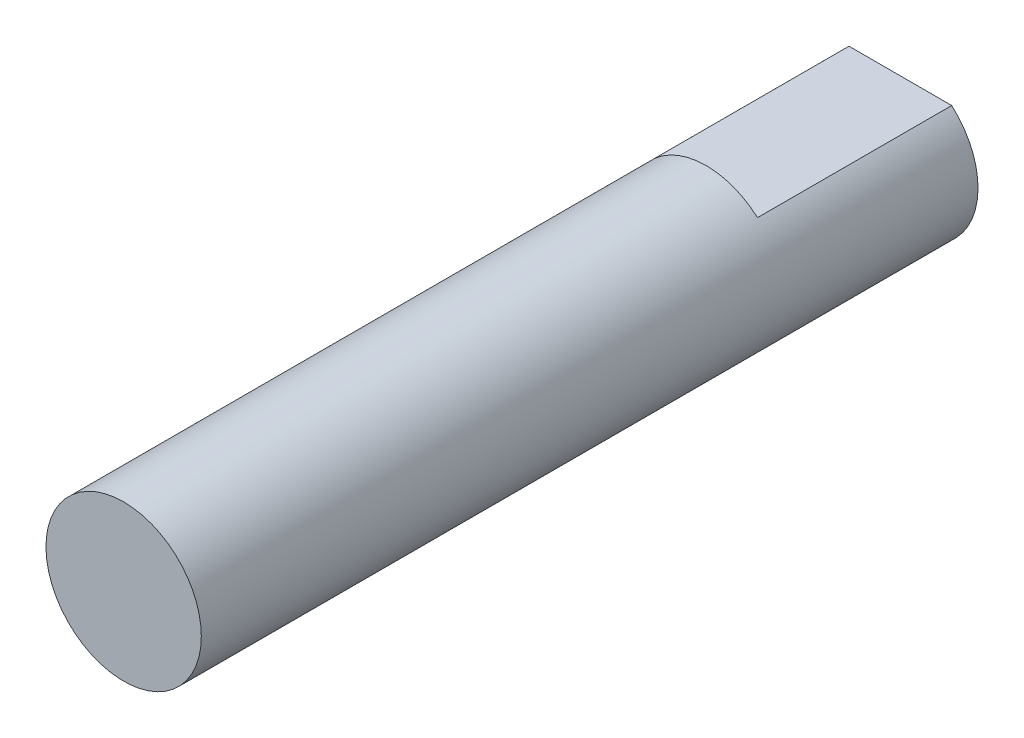
ISO-10303-21;
HEADER;
FILE_DESCRIPTION(('STEP AP214'),'2;1');
FILE_NAME('part.step','',(''),(''),'','','');
FILE_SCHEMA(('AUTOMOTIVE_DESIGN { 1 0 10303 214 1 1 1 1 }'));
ENDSEC;
DATA;
#1=APPLICATION_CONTEXT('core data for automotive mechanical design processes');
#2=APPLICATION_PROTOCOL_DEFINITION('international standard','automotive_design',2000,#1);
#3=PRODUCT_CONTEXT('',#1,'mechanical');
#4=PRODUCT('Part','Part','',(#3));
#5=PRODUCT_RELATED_PRODUCT_CATEGORY('part','',(#4));
#6=PRODUCT_DEFINITION_FORMATION('','',#4);
#7=PRODUCT_DEFINITION_CONTEXT('part definition',#1,'design');
#8=PRODUCT_DEFINITION('design','',#6,#7);
#9=PRODUCT_DEFINITION_SHAPE('','',#8);
#10=(LENGTH_UNIT() NAMED_UNIT(*) SI_UNIT(.MILLI.,.METRE.));
#11=(NAMED_UNIT(*) PLANE_ANGLE_UNIT() SI_UNIT($,.RADIAN.));
#12=(NAMED_UNIT(*) SI_UNIT($,.STERADIAN.) SOLID_ANGLE_UNIT());
#13=UNCERTAINTY_MEASURE_WITH_UNIT(LENGTH_MEASURE(1.E-05),#10,'distance_accuracy_value','');
#14=(GEOMETRIC_REPRESENTATION_CONTEXT(3) GLOBAL_UNCERTAINTY_ASSIGNED_CONTEXT((#13)) GLOBAL_UNIT_ASSIGNED_CONTEXT((#10,
#11,#12)) REPRESENTATION_CONTEXT('',''));
#15=CARTESIAN_POINT('',(0.,0.,0.));
#16=DIRECTION('',(0.,0.,1.));
#17=DIRECTION('',(1.,0.,0.));
#18=AXIS2_PLACEMENT_3D('',#15,#16,#17);
#19=CARTESIAN_POINT('',(0.,0.,40.));
#20=DIRECTION('',(0.,0.,-1.));
#21=DIRECTION('',(-1.,0.,0.));
#22=AXIS2_PLACEMENT_3D('',#19,#20,#21);
#23=CYLINDRICAL_SURFACE('',#22,4.);
#24=CARTESIAN_POINT('',(0.,0.,40.));
#25=DIRECTION('',(0.,0.,1.));
#26=DIRECTION('',(1.,0.,0.));
#27=AXIS2_PLACEMENT_3D('',#24,#25,#26);
#28=CIRCLE('',#27,4.);
#29=CARTESIAN_POINT('',(4.,0.,40.));
#30=VERTEX_POINT('',#29);
#31=EDGE_CURVE('E11',#30,#30,#28,.T.);
#32=ORIENTED_EDGE('',*,*,#31,.F.);
#33=EDGE_LOOP('',(#32));
#34=FACE_BOUND('',#33,.T.);
#35=DIRECTION('',(0.,0.,-1.));
#36=VECTOR('',#35,1.);
#37=CARTESIAN_POINT('',(2.64575131106459,3.,10.));
#38=LINE('',#37,#36);
#39=CARTESIAN_POINT('',(2.64575131106459,3.,10.));
#40=VERTEX_POINT('',#39);
#41=CARTESIAN_POINT('',(2.64575131106459,3.,0.));
#42=VERTEX_POINT('',#41);
#43=EDGE_CURVE('E58',#40,#42,#38,.T.);
#44=ORIENTED_EDGE('',*,*,#43,.F.);
#45=CARTESIAN_POINT('',(0.,0.,10.));
#46=DIRECTION('',(0.,0.,1.));
#47=DIRECTION('',(-1.,0.,0.));
#48=AXIS2_PLACEMENT_3D('',#45,#46,#47);
#49=CIRCLE('',#48,4.);
#50=CARTESIAN_POINT('',(-2.64575131106459,3.,10.));
#51=VERTEX_POINT('',#50);
#52=EDGE_CURVE('E77',#40,#51,#49,.T.);
#53=ORIENTED_EDGE('',*,*,#52,.T.);
#54=DIRECTION('',(0.,0.,-1.));
#55=VECTOR('',#54,1.);
#56=CARTESIAN_POINT('',(-2.64575131106459,3.,10.));
#57=LINE('',#56,#55);
#58=CARTESIAN_POINT('',(-2.64575131106459,3.,0.));
#59=VERTEX_POINT('',#58);
#60=EDGE_CURVE('E71',#51,#59,#57,.T.);
#61=ORIENTED_EDGE('',*,*,#60,.T.);
#62=CARTESIAN_POINT('',(0.,0.,0.));
#63=DIRECTION('',(0.,0.,1.));
#64=DIRECTION('',(1.,0.,0.));
#65=AXIS2_PLACEMENT_3D('',#62,#63,#64);
#66=CIRCLE('',#65,4.);
#67=EDGE_CURVE('E46',#59,#42,#66,.T.);
#68=ORIENTED_EDGE('',*,*,#67,.T.);
#69=EDGE_LOOP('',(#44,#53,#61,#68));
#70=FACE_BOUND('',#69,.T.);
#71=ADVANCED_FACE('F43',(#34,#70),#23,.T.);
#72=CARTESIAN_POINT('',(0.,0.,0.));
#73=DIRECTION('',(0.,0.,1.));
#74=DIRECTION('',(1.,0.,0.));
#75=AXIS2_PLACEMENT_3D('',#72,#73,#74);
#76=PLANE('',#75);
#77=DIRECTION('',(1.,0.,0.));
#78=VECTOR('',#77,1.);
#79=CARTESIAN_POINT('',(-2.64575131106459,3.,0.));
#80=LINE('',#79,#78);
#81=EDGE_CURVE('E68',#59,#42,#80,.T.);
#82=ORIENTED_EDGE('',*,*,#81,.T.);
#83=ORIENTED_EDGE('',*,*,#67,.F.);
#84=EDGE_LOOP('',(#82,#83));
#85=FACE_BOUND('',#84,.T.);
#86=ADVANCED_FACE('F82',(#85),#76,.F.);
#87=CARTESIAN_POINT('',(0.,0.,40.));
#88=DIRECTION('',(0.,0.,1.));
#89=DIRECTION('',(1.,0.,0.));
#90=AXIS2_PLACEMENT_3D('',#87,#88,#89);
#91=PLANE('',#90);
#92=ORIENTED_EDGE('',*,*,#31,.T.);
#93=EDGE_LOOP('',(#92));
#94=FACE_BOUND('',#93,.T.);
#95=ADVANCED_FACE('F91',(#94),#91,.T.);
#96=CARTESIAN_POINT('',(-2.64575131106459,3.,10.));
#97=DIRECTION('',(0.,1.,0.));
#98=DIRECTION('',(0.,0.,1.));
#99=AXIS2_PLACEMENT_3D('',#96,#97,#98);
#100=PLANE('',#99);
#101=ORIENTED_EDGE('',*,*,#81,.F.);
#102=ORIENTED_EDGE('',*,*,#60,.F.);
#103=DIRECTION('',(1.,0.,0.));
#104=VECTOR('',#103,1.);
#105=CARTESIAN_POINT('',(-2.64575131106459,3.,10.));
#106=LINE('',#105,#104);
#107=EDGE_CURVE('E64',#51,#40,#106,.T.);
#108=ORIENTED_EDGE('',*,*,#107,.T.);
#109=ORIENTED_EDGE('',*,*,#43,.T.);
#110=EDGE_LOOP('',(#101,#102,#108,#109));
#111=FACE_BOUND('',#110,.T.);
#112=ADVANCED_FACE('F70',(#111),#100,.T.);
#113=CARTESIAN_POINT('',(0.,0.,10.));
#114=DIRECTION('',(0.,0.,-1.));
#115=DIRECTION('',(-1.,0.,0.));
#116=AXIS2_PLACEMENT_3D('',#113,#114,#115);
#117=PLANE('',#116);
#118=ORIENTED_EDGE('',*,*,#52,.F.);
#119=ORIENTED_EDGE('',*,*,#107,.F.);
#120=EDGE_LOOP('',(#118,#119));
#121=FACE_BOUND('',#120,.T.);
#122=ADVANCED_FACE('F102',(#121),#117,.T.);
#123=CLOSED_SHELL('',(#71,#86,#95,#112,#122));
#124=MANIFOLD_SOLID_BREP('B2',#123);
#125=ADVANCED_BREP_SHAPE_REPRESENTATION('',(#18,#124),#14);
#126=SHAPE_DEFINITION_REPRESENTATION(#9,#125);
ENDSEC;
END-ISO-10303-21;
